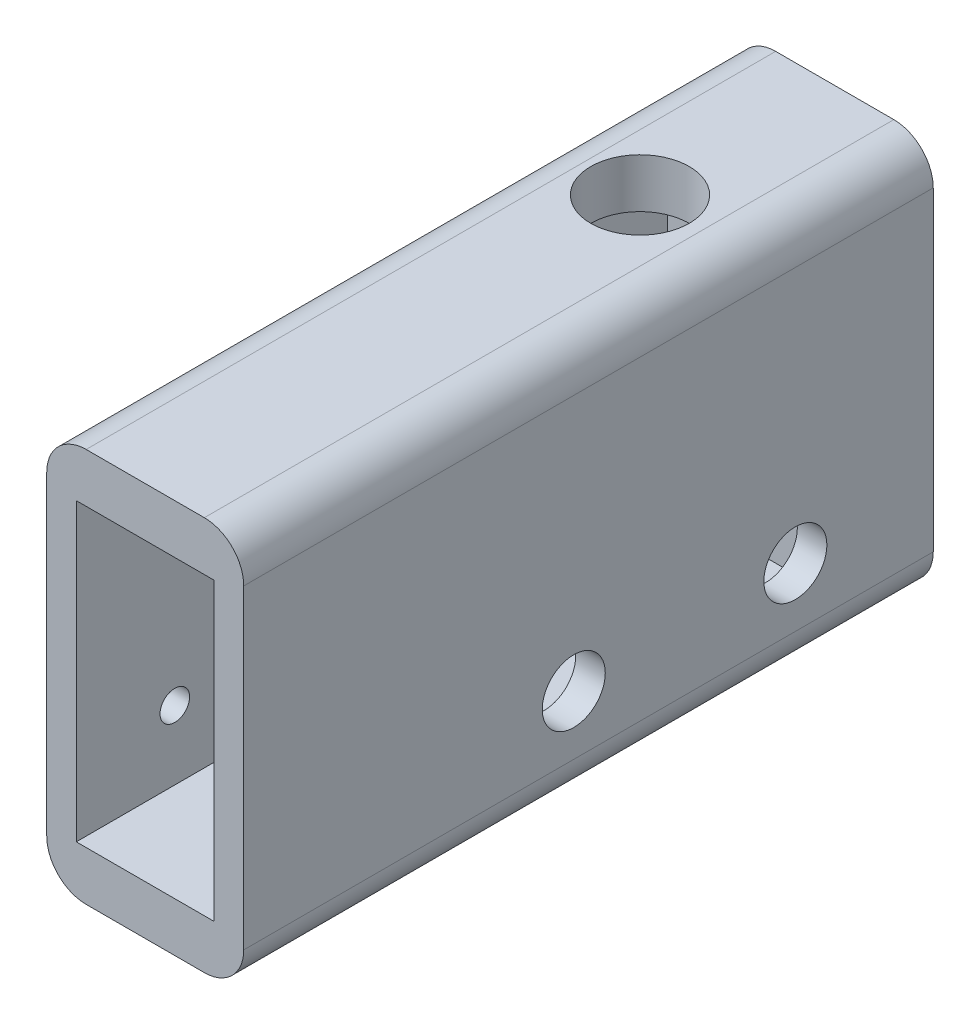
ISO-10303-21;
HEADER;
FILE_DESCRIPTION(('STEP AP214'),'2;1');
FILE_NAME('part.step','',(''),(''),'','','');
FILE_SCHEMA(('AUTOMOTIVE_DESIGN { 1 0 10303 214 1 1 1 1 }'));
ENDSEC;
DATA;
#1=APPLICATION_CONTEXT('core data for automotive mechanical design processes');
#2=APPLICATION_PROTOCOL_DEFINITION('international standard','automotive_design',2000,#1);
#3=PRODUCT_CONTEXT('',#1,'mechanical');
#4=PRODUCT('Part','Part','',(#3));
#5=PRODUCT_RELATED_PRODUCT_CATEGORY('part','',(#4));
#6=PRODUCT_DEFINITION_FORMATION('','',#4);
#7=PRODUCT_DEFINITION_CONTEXT('part definition',#1,'design');
#8=PRODUCT_DEFINITION('design','',#6,#7);
#9=PRODUCT_DEFINITION_SHAPE('','',#8);
#10=(LENGTH_UNIT() NAMED_UNIT(*) SI_UNIT(.MILLI.,.METRE.));
#11=(NAMED_UNIT(*) PLANE_ANGLE_UNIT() SI_UNIT($,.RADIAN.));
#12=(NAMED_UNIT(*) SI_UNIT($,.STERADIAN.) SOLID_ANGLE_UNIT());
#13=UNCERTAINTY_MEASURE_WITH_UNIT(LENGTH_MEASURE(1.E-05),#10,'distance_accuracy_value','');
#14=(GEOMETRIC_REPRESENTATION_CONTEXT(3) GLOBAL_UNCERTAINTY_ASSIGNED_CONTEXT((#13)) GLOBAL_UNIT_ASSIGNED_CONTEXT((#10,
#11,#12)) REPRESENTATION_CONTEXT('',''));
#15=CARTESIAN_POINT('',(0.,0.,0.));
#16=DIRECTION('',(0.,0.,1.));
#17=DIRECTION('',(1.,0.,0.));
#18=AXIS2_PLACEMENT_3D('',#15,#16,#17);
#19=CARTESIAN_POINT('',(0.,0.,35.));
#20=DIRECTION('',(1.,0.,0.));
#21=DIRECTION('',(0.,0.,-1.));
#22=AXIS2_PLACEMENT_3D('',#19,#20,#21);
#23=PLANE('',#22);
#24=CARTESIAN_POINT('',(0.,5.,18.2481238100749));
#25=DIRECTION('',(1.,0.,0.));
#26=DIRECTION('',(0.,0.,-1.));
#27=AXIS2_PLACEMENT_3D('',#24,#25,#26);
#28=CIRCLE('',#27,1.6);
#29=CARTESIAN_POINT('',(0.,5.,16.6481238100749));
#30=VERTEX_POINT('',#29);
#31=EDGE_CURVE('E404',#30,#30,#28,.T.);
#32=ORIENTED_EDGE('',*,*,#31,.T.);
#33=EDGE_LOOP('',(#32));
#34=FACE_BOUND('',#33,.T.);
#35=CARTESIAN_POINT('',(0.,5.,7.));
#36=DIRECTION('',(1.,0.,0.));
#37=DIRECTION('',(0.,0.,-1.));
#38=AXIS2_PLACEMENT_3D('',#35,#36,#37);
#39=CIRCLE('',#38,1.6);
#40=CARTESIAN_POINT('',(0.,5.,5.4));
#41=VERTEX_POINT('',#40);
#42=EDGE_CURVE('E238',#41,#41,#39,.T.);
#43=ORIENTED_EDGE('',*,*,#42,.T.);
#44=EDGE_LOOP('',(#43));
#45=FACE_BOUND('',#44,.T.);
#46=CARTESIAN_POINT('',(0.,6.,30.));
#47=DIRECTION('',(-1.,0.,0.));
#48=DIRECTION('',(0.,0.,1.));
#49=AXIS2_PLACEMENT_3D('',#46,#47,#48);
#50=CIRCLE('',#49,0.750000000000002);
#51=CARTESIAN_POINT('',(0.,6.,30.75));
#52=VERTEX_POINT('',#51);
#53=EDGE_CURVE('E205',#52,#52,#50,.T.);
#54=ORIENTED_EDGE('',*,*,#53,.F.);
#55=EDGE_LOOP('',(#54));
#56=FACE_BOUND('',#55,.T.);
#57=CARTESIAN_POINT('',(0.,14.,30.));
#58=DIRECTION('',(-1.,0.,0.));
#59=DIRECTION('',(0.,0.,1.));
#60=AXIS2_PLACEMENT_3D('',#57,#58,#59);
#61=CIRCLE('',#60,0.750000000000002);
#62=CARTESIAN_POINT('',(0.,14.,30.75));
#63=VERTEX_POINT('',#62);
#64=EDGE_CURVE('E201',#63,#63,#61,.T.);
#65=ORIENTED_EDGE('',*,*,#64,.F.);
#66=EDGE_LOOP('',(#65));
#67=FACE_BOUND('',#66,.T.);
#68=DIRECTION('',(0.,-1.,0.));
#69=VECTOR('',#68,1.);
#70=CARTESIAN_POINT('',(0.,0.,0.));
#71=LINE('',#70,#69);
#72=CARTESIAN_POINT('',(0.,18.,0.));
#73=VERTEX_POINT('',#72);
#74=CARTESIAN_POINT('',(0.,2.,0.));
#75=VERTEX_POINT('',#74);
#76=EDGE_CURVE('E168',#73,#75,#71,.T.);
#77=ORIENTED_EDGE('',*,*,#76,.T.);
#78=DIRECTION('',(0.,0.,-1.));
#79=VECTOR('',#78,1.);
#80=CARTESIAN_POINT('',(0.,2.,35.));
#81=LINE('',#80,#79);
#82=CARTESIAN_POINT('',(0.,2.,35.));
#83=VERTEX_POINT('',#82);
#84=EDGE_CURVE('E11',#75,#83,#81,.F.);
#85=ORIENTED_EDGE('',*,*,#84,.T.);
#86=DIRECTION('',(0.,-1.,0.));
#87=VECTOR('',#86,1.);
#88=CARTESIAN_POINT('',(0.,0.,35.));
#89=LINE('',#88,#87);
#90=CARTESIAN_POINT('',(0.,18.,35.));
#91=VERTEX_POINT('',#90);
#92=EDGE_CURVE('E172',#91,#83,#89,.T.);
#93=ORIENTED_EDGE('',*,*,#92,.F.);
#94=DIRECTION('',(0.,0.,-1.));
#95=VECTOR('',#94,1.);
#96=CARTESIAN_POINT('',(0.,18.,35.));
#97=LINE('',#96,#95);
#98=EDGE_CURVE('E42',#91,#73,#97,.T.);
#99=ORIENTED_EDGE('',*,*,#98,.T.);
#100=EDGE_LOOP('',(#77,#85,#93,#99));
#101=FACE_BOUND('',#100,.T.);
#102=ADVANCED_FACE('F33',(#34,#45,#56,#67,#101),#23,.F.);
#103=CARTESIAN_POINT('',(0.,0.,35.));
#104=DIRECTION('',(0.,1.,0.));
#105=DIRECTION('',(0.,0.,1.));
#106=AXIS2_PLACEMENT_3D('',#103,#104,#105);
#107=PLANE('',#106);
#108=DIRECTION('',(1.,0.,0.));
#109=VECTOR('',#108,1.);
#110=CARTESIAN_POINT('',(0.,0.,0.));
#111=LINE('',#110,#109);
#112=CARTESIAN_POINT('',(2.,0.,0.));
#113=VERTEX_POINT('',#112);
#114=CARTESIAN_POINT('',(8.,0.,0.));
#115=VERTEX_POINT('',#114);
#116=EDGE_CURVE('E186',#113,#115,#111,.T.);
#117=ORIENTED_EDGE('',*,*,#116,.T.);
#118=DIRECTION('',(0.,0.,-1.));
#119=VECTOR('',#118,1.);
#120=CARTESIAN_POINT('',(8.,0.,35.));
#121=LINE('',#120,#119);
#122=CARTESIAN_POINT('',(8.,0.,35.));
#123=VERTEX_POINT('',#122);
#124=EDGE_CURVE('E50',#115,#123,#121,.F.);
#125=ORIENTED_EDGE('',*,*,#124,.T.);
#126=DIRECTION('',(1.,0.,0.));
#127=VECTOR('',#126,1.);
#128=CARTESIAN_POINT('',(0.,0.,35.));
#129=LINE('',#128,#127);
#130=CARTESIAN_POINT('',(2.,0.,35.));
#131=VERTEX_POINT('',#130);
#132=EDGE_CURVE('E174',#131,#123,#129,.T.);
#133=ORIENTED_EDGE('',*,*,#132,.F.);
#134=DIRECTION('',(0.,0.,-1.));
#135=VECTOR('',#134,1.);
#136=CARTESIAN_POINT('',(2.,0.,35.));
#137=LINE('',#136,#135);
#138=EDGE_CURVE('E230',#131,#113,#137,.T.);
#139=ORIENTED_EDGE('',*,*,#138,.T.);
#140=EDGE_LOOP('',(#117,#125,#133,#139));
#141=FACE_BOUND('',#140,.T.);
#142=ADVANCED_FACE('F287',(#141),#107,.F.);
#143=CARTESIAN_POINT('',(10.,0.,35.));
#144=DIRECTION('',(-1.,0.,0.));
#145=DIRECTION('',(0.,0.,1.));
#146=AXIS2_PLACEMENT_3D('',#143,#144,#145);
#147=PLANE('',#146);
#148=CARTESIAN_POINT('',(10.,5.,18.2481238100749));
#149=DIRECTION('',(1.,0.,0.));
#150=DIRECTION('',(0.,0.,-1.));
#151=AXIS2_PLACEMENT_3D('',#148,#149,#150);
#152=CIRCLE('',#151,1.6);
#153=CARTESIAN_POINT('',(10.,5.,16.6481238100749));
#154=VERTEX_POINT('',#153);
#155=EDGE_CURVE('E409',#154,#154,#152,.T.);
#156=ORIENTED_EDGE('',*,*,#155,.F.);
#157=EDGE_LOOP('',(#156));
#158=FACE_BOUND('',#157,.T.);
#159=CARTESIAN_POINT('',(10.,5.,7.));
#160=DIRECTION('',(1.,0.,0.));
#161=DIRECTION('',(0.,0.,-1.));
#162=AXIS2_PLACEMENT_3D('',#159,#160,#161);
#163=CIRCLE('',#162,1.6);
#164=CARTESIAN_POINT('',(10.,5.,5.4));
#165=VERTEX_POINT('',#164);
#166=EDGE_CURVE('E244',#165,#165,#163,.T.);
#167=ORIENTED_EDGE('',*,*,#166,.F.);
#168=EDGE_LOOP('',(#167));
#169=FACE_BOUND('',#168,.T.);
#170=DIRECTION('',(0.,1.,0.));
#171=VECTOR('',#170,1.);
#172=CARTESIAN_POINT('',(10.,0.,0.));
#173=LINE('',#172,#171);
#174=CARTESIAN_POINT('',(10.,2.,0.));
#175=VERTEX_POINT('',#174);
#176=CARTESIAN_POINT('',(10.,18.,0.));
#177=VERTEX_POINT('',#176);
#178=EDGE_CURVE('E188',#175,#177,#173,.T.);
#179=ORIENTED_EDGE('',*,*,#178,.T.);
#180=DIRECTION('',(0.,0.,-1.));
#181=VECTOR('',#180,1.);
#182=CARTESIAN_POINT('',(10.,18.,35.));
#183=LINE('',#182,#181);
#184=CARTESIAN_POINT('',(10.,18.,35.));
#185=VERTEX_POINT('',#184);
#186=EDGE_CURVE('E221',#177,#185,#183,.F.);
#187=ORIENTED_EDGE('',*,*,#186,.T.);
#188=DIRECTION('',(0.,1.,0.));
#189=VECTOR('',#188,1.);
#190=CARTESIAN_POINT('',(10.,0.,35.));
#191=LINE('',#190,#189);
#192=CARTESIAN_POINT('',(10.,2.,35.));
#193=VERTEX_POINT('',#192);
#194=EDGE_CURVE('E177',#193,#185,#191,.T.);
#195=ORIENTED_EDGE('',*,*,#194,.F.);
#196=DIRECTION('',(0.,0.,-1.));
#197=VECTOR('',#196,1.);
#198=CARTESIAN_POINT('',(10.,2.,35.));
#199=LINE('',#198,#197);
#200=EDGE_CURVE('E218',#193,#175,#199,.T.);
#201=ORIENTED_EDGE('',*,*,#200,.T.);
#202=EDGE_LOOP('',(#179,#187,#195,#201));
#203=FACE_BOUND('',#202,.T.);
#204=ADVANCED_FACE('F295',(#158,#169,#203),#147,.F.);
#205=CARTESIAN_POINT('',(0.,20.,35.));
#206=DIRECTION('',(0.,-1.,0.));
#207=DIRECTION('',(0.,0.,-1.));
#208=AXIS2_PLACEMENT_3D('',#205,#206,#207);
#209=PLANE('',#208);
#210=CARTESIAN_POINT('',(4.86841114956782,20.,9.75455177553286));
#211=DIRECTION('',(0.,1.,0.));
#212=DIRECTION('',(0.,0.,1.));
#213=AXIS2_PLACEMENT_3D('',#210,#211,#212);
#214=CIRCLE('',#213,2.5);
#215=CARTESIAN_POINT('',(4.86841114956782,20.,12.2545517755329));
#216=VERTEX_POINT('',#215);
#217=EDGE_CURVE('E197',#216,#216,#214,.T.);
#218=ORIENTED_EDGE('',*,*,#217,.F.);
#219=EDGE_LOOP('',(#218));
#220=FACE_BOUND('',#219,.T.);
#221=DIRECTION('',(-1.,0.,0.));
#222=VECTOR('',#221,1.);
#223=CARTESIAN_POINT('',(0.,20.,35.));
#224=LINE('',#223,#222);
#225=CARTESIAN_POINT('',(8.,20.,35.));
#226=VERTEX_POINT('',#225);
#227=CARTESIAN_POINT('',(2.,20.,35.));
#228=VERTEX_POINT('',#227);
#229=EDGE_CURVE('E180',#226,#228,#224,.T.);
#230=ORIENTED_EDGE('',*,*,#229,.F.);
#231=DIRECTION('',(0.,0.,-1.));
#232=VECTOR('',#231,1.);
#233=CARTESIAN_POINT('',(8.,20.,35.));
#234=LINE('',#233,#232);
#235=CARTESIAN_POINT('',(8.,20.,0.));
#236=VERTEX_POINT('',#235);
#237=EDGE_CURVE('E207',#226,#236,#234,.T.);
#238=ORIENTED_EDGE('',*,*,#237,.T.);
#239=DIRECTION('',(-1.,0.,0.));
#240=VECTOR('',#239,1.);
#241=CARTESIAN_POINT('',(0.,20.,0.));
#242=LINE('',#241,#240);
#243=CARTESIAN_POINT('',(2.,20.,0.));
#244=VERTEX_POINT('',#243);
#245=EDGE_CURVE('E175',#236,#244,#242,.T.);
#246=ORIENTED_EDGE('',*,*,#245,.T.);
#247=DIRECTION('',(0.,0.,-1.));
#248=VECTOR('',#247,1.);
#249=CARTESIAN_POINT('',(2.,20.,35.));
#250=LINE('',#249,#248);
#251=EDGE_CURVE('E183',#244,#228,#250,.F.);
#252=ORIENTED_EDGE('',*,*,#251,.T.);
#253=EDGE_LOOP('',(#230,#238,#246,#252));
#254=FACE_BOUND('',#253,.T.);
#255=ADVANCED_FACE('F334',(#220,#254),#209,.F.);
#256=CARTESIAN_POINT('',(0.,0.,35.));
#257=DIRECTION('',(0.,0.,-1.));
#258=DIRECTION('',(-1.,0.,0.));
#259=AXIS2_PLACEMENT_3D('',#256,#257,#258);
#260=PLANE('',#259);
#261=DIRECTION('',(1.,0.,0.));
#262=VECTOR('',#261,1.);
#263=CARTESIAN_POINT('',(1.5,2.5,35.));
#264=LINE('',#263,#262);
#265=CARTESIAN_POINT('',(1.5,2.5,35.));
#266=VERTEX_POINT('',#265);
#267=CARTESIAN_POINT('',(8.5,2.5,35.));
#268=VERTEX_POINT('',#267);
#269=EDGE_CURVE('E161',#266,#268,#264,.T.);
#270=ORIENTED_EDGE('',*,*,#269,.F.);
#271=DIRECTION('',(0.,-1.,0.));
#272=VECTOR('',#271,1.);
#273=CARTESIAN_POINT('',(1.5,2.5,35.));
#274=LINE('',#273,#272);
#275=CARTESIAN_POINT('',(1.5,17.5,35.));
#276=VERTEX_POINT('',#275);
#277=EDGE_CURVE('E132',#276,#266,#274,.T.);
#278=ORIENTED_EDGE('',*,*,#277,.F.);
#279=DIRECTION('',(-1.,0.,0.));
#280=VECTOR('',#279,1.);
#281=CARTESIAN_POINT('',(1.5,17.5,35.));
#282=LINE('',#281,#280);
#283=CARTESIAN_POINT('',(8.5,17.5,35.));
#284=VERTEX_POINT('',#283);
#285=EDGE_CURVE('E149',#284,#276,#282,.T.);
#286=ORIENTED_EDGE('',*,*,#285,.F.);
#287=DIRECTION('',(0.,1.,0.));
#288=VECTOR('',#287,1.);
#289=CARTESIAN_POINT('',(8.5,2.5,35.));
#290=LINE('',#289,#288);
#291=EDGE_CURVE('E152',#268,#284,#290,.T.);
#292=ORIENTED_EDGE('',*,*,#291,.F.);
#293=EDGE_LOOP('',(#270,#278,#286,#292));
#294=FACE_BOUND('',#293,.T.);
#295=ORIENTED_EDGE('',*,*,#194,.T.);
#296=CARTESIAN_POINT('',(8.,18.,35.));
#297=DIRECTION('',(0.,0.,-1.));
#298=DIRECTION('',(-1.,0.,0.));
#299=AXIS2_PLACEMENT_3D('',#296,#297,#298);
#300=CIRCLE('',#299,2.);
#301=EDGE_CURVE('E228',#185,#226,#300,.F.);
#302=ORIENTED_EDGE('',*,*,#301,.T.);
#303=ORIENTED_EDGE('',*,*,#229,.T.);
#304=CARTESIAN_POINT('',(2.,18.,35.));
#305=DIRECTION('',(0.,0.,-1.));
#306=DIRECTION('',(-1.,0.,0.));
#307=AXIS2_PLACEMENT_3D('',#304,#305,#306);
#308=CIRCLE('',#307,2.);
#309=EDGE_CURVE('E223',#228,#91,#308,.F.);
#310=ORIENTED_EDGE('',*,*,#309,.T.);
#311=ORIENTED_EDGE('',*,*,#92,.T.);
#312=CARTESIAN_POINT('',(2.,2.,35.));
#313=DIRECTION('',(0.,0.,-1.));
#314=DIRECTION('',(-1.,0.,0.));
#315=AXIS2_PLACEMENT_3D('',#312,#313,#314);
#316=CIRCLE('',#315,2.);
#317=EDGE_CURVE('E57',#83,#131,#316,.F.);
#318=ORIENTED_EDGE('',*,*,#317,.T.);
#319=ORIENTED_EDGE('',*,*,#132,.T.);
#320=CARTESIAN_POINT('',(8.,2.,35.));
#321=DIRECTION('',(0.,0.,-1.));
#322=DIRECTION('',(-1.,0.,0.));
#323=AXIS2_PLACEMENT_3D('',#320,#321,#322);
#324=CIRCLE('',#323,2.);
#325=EDGE_CURVE('E226',#123,#193,#324,.F.);
#326=ORIENTED_EDGE('',*,*,#325,.T.);
#327=EDGE_LOOP('',(#295,#302,#303,#310,#311,#318,#319,#326));
#328=FACE_BOUND('',#327,.T.);
#329=ADVANCED_FACE('F330',(#294,#328),#260,.F.);
#330=CARTESIAN_POINT('',(0.,0.,0.));
#331=DIRECTION('',(0.,0.,-1.));
#332=DIRECTION('',(-1.,0.,0.));
#333=AXIS2_PLACEMENT_3D('',#330,#331,#332);
#334=PLANE('',#333);
#335=CARTESIAN_POINT('',(5.,6.28024824363482,0.));
#336=DIRECTION('',(0.,0.,1.));
#337=DIRECTION('',(1.,0.,0.));
#338=AXIS2_PLACEMENT_3D('',#335,#336,#337);
#339=CIRCLE('',#338,1.55);
#340=CARTESIAN_POINT('',(6.55,6.28024824363482,0.));
#341=VERTEX_POINT('',#340);
#342=EDGE_CURVE('E260',#341,#341,#339,.T.);
#343=ORIENTED_EDGE('',*,*,#342,.T.);
#344=EDGE_LOOP('',(#343));
#345=FACE_BOUND('',#344,.T.);
#346=CARTESIAN_POINT('',(5.,14.527380154147,0.));
#347=DIRECTION('',(0.,0.,1.));
#348=DIRECTION('',(1.,0.,0.));
#349=AXIS2_PLACEMENT_3D('',#346,#347,#348);
#350=CIRCLE('',#349,1.55);
#351=CARTESIAN_POINT('',(6.55,14.527380154147,0.));
#352=VERTEX_POINT('',#351);
#353=EDGE_CURVE('E162',#352,#352,#350,.T.);
#354=ORIENTED_EDGE('',*,*,#353,.T.);
#355=EDGE_LOOP('',(#354));
#356=FACE_BOUND('',#355,.T.);
#357=ORIENTED_EDGE('',*,*,#245,.F.);
#358=CARTESIAN_POINT('',(8.,18.,0.));
#359=DIRECTION('',(0.,0.,-1.));
#360=DIRECTION('',(-1.,0.,0.));
#361=AXIS2_PLACEMENT_3D('',#358,#359,#360);
#362=CIRCLE('',#361,2.);
#363=EDGE_CURVE('E216',#236,#177,#362,.T.);
#364=ORIENTED_EDGE('',*,*,#363,.T.);
#365=ORIENTED_EDGE('',*,*,#178,.F.);
#366=CARTESIAN_POINT('',(8.,2.,0.));
#367=DIRECTION('',(0.,0.,-1.));
#368=DIRECTION('',(-1.,0.,0.));
#369=AXIS2_PLACEMENT_3D('',#366,#367,#368);
#370=CIRCLE('',#369,2.);
#371=EDGE_CURVE('E214',#175,#115,#370,.T.);
#372=ORIENTED_EDGE('',*,*,#371,.T.);
#373=ORIENTED_EDGE('',*,*,#116,.F.);
#374=CARTESIAN_POINT('',(2.,2.,0.));
#375=DIRECTION('',(0.,0.,-1.));
#376=DIRECTION('',(-1.,0.,0.));
#377=AXIS2_PLACEMENT_3D('',#374,#375,#376);
#378=CIRCLE('',#377,2.);
#379=EDGE_CURVE('E212',#113,#75,#378,.T.);
#380=ORIENTED_EDGE('',*,*,#379,.T.);
#381=ORIENTED_EDGE('',*,*,#76,.F.);
#382=CARTESIAN_POINT('',(2.,18.,0.));
#383=DIRECTION('',(0.,0.,-1.));
#384=DIRECTION('',(-1.,0.,0.));
#385=AXIS2_PLACEMENT_3D('',#382,#383,#384);
#386=CIRCLE('',#385,2.);
#387=EDGE_CURVE('E210',#73,#244,#386,.T.);
#388=ORIENTED_EDGE('',*,*,#387,.T.);
#389=EDGE_LOOP('',(#357,#364,#365,#372,#373,#380,#381,#388));
#390=FACE_BOUND('',#389,.T.);
#391=ADVANCED_FACE('F321',(#345,#356,#390),#334,.T.);
#392=CARTESIAN_POINT('',(1.5,2.5,5.));
#393=DIRECTION('',(-1.,0.,0.));
#394=DIRECTION('',(0.,0.,1.));
#395=AXIS2_PLACEMENT_3D('',#392,#393,#394);
#396=PLANE('',#395);
#397=CARTESIAN_POINT('',(1.5,5.,18.2481238100749));
#398=DIRECTION('',(-1.,0.,0.));
#399=DIRECTION('',(0.,0.,1.));
#400=AXIS2_PLACEMENT_3D('',#397,#398,#399);
#401=CIRCLE('',#400,1.6);
#402=CARTESIAN_POINT('',(1.5,5.,19.8481238100749));
#403=VERTEX_POINT('',#402);
#404=EDGE_CURVE('E249',#403,#403,#401,.T.);
#405=ORIENTED_EDGE('',*,*,#404,.T.);
#406=EDGE_LOOP('',(#405));
#407=FACE_BOUND('',#406,.T.);
#408=CARTESIAN_POINT('',(1.5,5.,7.));
#409=DIRECTION('',(-1.,0.,0.));
#410=DIRECTION('',(0.,0.,1.));
#411=AXIS2_PLACEMENT_3D('',#408,#409,#410);
#412=CIRCLE('',#411,1.6);
#413=CARTESIAN_POINT('',(1.5,5.,8.6));
#414=VERTEX_POINT('',#413);
#415=EDGE_CURVE('E237',#414,#414,#412,.T.);
#416=ORIENTED_EDGE('',*,*,#415,.T.);
#417=EDGE_LOOP('',(#416));
#418=FACE_BOUND('',#417,.T.);
#419=CARTESIAN_POINT('',(1.5,6.,30.));
#420=DIRECTION('',(-1.,0.,0.));
#421=DIRECTION('',(0.,0.,1.));
#422=AXIS2_PLACEMENT_3D('',#419,#420,#421);
#423=CIRCLE('',#422,0.750000000000002);
#424=CARTESIAN_POINT('',(1.5,6.,30.75));
#425=VERTEX_POINT('',#424);
#426=EDGE_CURVE('E202',#425,#425,#423,.T.);
#427=ORIENTED_EDGE('',*,*,#426,.T.);
#428=EDGE_LOOP('',(#427));
#429=FACE_BOUND('',#428,.T.);
#430=CARTESIAN_POINT('',(1.5,14.,30.));
#431=DIRECTION('',(-1.,0.,0.));
#432=DIRECTION('',(0.,0.,1.));
#433=AXIS2_PLACEMENT_3D('',#430,#431,#432);
#434=CIRCLE('',#433,0.750000000000002);
#435=CARTESIAN_POINT('',(1.5,14.,30.75));
#436=VERTEX_POINT('',#435);
#437=EDGE_CURVE('E198',#436,#436,#434,.T.);
#438=ORIENTED_EDGE('',*,*,#437,.T.);
#439=EDGE_LOOP('',(#438));
#440=FACE_BOUND('',#439,.T.);
#441=ORIENTED_EDGE('',*,*,#277,.T.);
#442=DIRECTION('',(0.,0.,1.));
#443=VECTOR('',#442,1.);
#444=CARTESIAN_POINT('',(1.5,2.5,5.));
#445=LINE('',#444,#443);
#446=CARTESIAN_POINT('',(1.5,2.5,5.));
#447=VERTEX_POINT('',#446);
#448=EDGE_CURVE('E125',#447,#266,#445,.T.);
#449=ORIENTED_EDGE('',*,*,#448,.F.);
#450=DIRECTION('',(0.,-1.,0.));
#451=VECTOR('',#450,1.);
#452=CARTESIAN_POINT('',(1.5,2.5,5.));
#453=LINE('',#452,#451);
#454=CARTESIAN_POINT('',(1.5,17.5,5.));
#455=VERTEX_POINT('',#454);
#456=EDGE_CURVE('E129',#455,#447,#453,.T.);
#457=ORIENTED_EDGE('',*,*,#456,.F.);
#458=DIRECTION('',(0.,0.,1.));
#459=VECTOR('',#458,1.);
#460=CARTESIAN_POINT('',(1.5,17.5,5.));
#461=LINE('',#460,#459);
#462=EDGE_CURVE('E166',#455,#276,#461,.T.);
#463=ORIENTED_EDGE('',*,*,#462,.T.);
#464=EDGE_LOOP('',(#441,#449,#457,#463));
#465=FACE_BOUND('',#464,.T.);
#466=ADVANCED_FACE('F127',(#407,#418,#429,#440,#465),#396,.F.);
#467=CARTESIAN_POINT('',(1.5,17.5,5.));
#468=DIRECTION('',(0.,1.,0.));
#469=DIRECTION('',(0.,0.,1.));
#470=AXIS2_PLACEMENT_3D('',#467,#468,#469);
#471=PLANE('',#470);
#472=CARTESIAN_POINT('',(4.86841114956782,17.5,9.75455177553286));
#473=DIRECTION('',(0.,1.,0.));
#474=DIRECTION('',(0.,0.,1.));
#475=AXIS2_PLACEMENT_3D('',#472,#473,#474);
#476=CIRCLE('',#475,2.5);
#477=CARTESIAN_POINT('',(4.86841114956782,17.5,12.2545517755329));
#478=VERTEX_POINT('',#477);
#479=EDGE_CURVE('E193',#478,#478,#476,.T.);
#480=ORIENTED_EDGE('',*,*,#479,.T.);
#481=EDGE_LOOP('',(#480));
#482=FACE_BOUND('',#481,.T.);
#483=ORIENTED_EDGE('',*,*,#285,.T.);
#484=ORIENTED_EDGE('',*,*,#462,.F.);
#485=DIRECTION('',(-1.,0.,0.));
#486=VECTOR('',#485,1.);
#487=CARTESIAN_POINT('',(1.5,17.5,5.));
#488=LINE('',#487,#486);
#489=CARTESIAN_POINT('',(8.5,17.5,5.));
#490=VERTEX_POINT('',#489);
#491=EDGE_CURVE('E137',#490,#455,#488,.T.);
#492=ORIENTED_EDGE('',*,*,#491,.F.);
#493=DIRECTION('',(0.,0.,1.));
#494=VECTOR('',#493,1.);
#495=CARTESIAN_POINT('',(8.5,17.5,5.));
#496=LINE('',#495,#494);
#497=EDGE_CURVE('E169',#490,#284,#496,.T.);
#498=ORIENTED_EDGE('',*,*,#497,.T.);
#499=EDGE_LOOP('',(#483,#484,#492,#498));
#500=FACE_BOUND('',#499,.T.);
#501=ADVANCED_FACE('F356',(#482,#500),#471,.F.);
#502=CARTESIAN_POINT('',(8.5,2.5,5.));
#503=DIRECTION('',(1.,0.,0.));
#504=DIRECTION('',(0.,0.,-1.));
#505=AXIS2_PLACEMENT_3D('',#502,#503,#504);
#506=PLANE('',#505);
#507=CARTESIAN_POINT('',(8.5,5.,18.2481238100749));
#508=DIRECTION('',(1.,0.,0.));
#509=DIRECTION('',(0.,0.,-1.));
#510=AXIS2_PLACEMENT_3D('',#507,#508,#509);
#511=CIRCLE('',#510,1.6);
#512=CARTESIAN_POINT('',(8.5,5.,16.6481238100749));
#513=VERTEX_POINT('',#512);
#514=EDGE_CURVE('E37',#513,#513,#511,.T.);
#515=ORIENTED_EDGE('',*,*,#514,.T.);
#516=EDGE_LOOP('',(#515));
#517=FACE_BOUND('',#516,.T.);
#518=CARTESIAN_POINT('',(8.5,5.,7.));
#519=DIRECTION('',(1.,0.,0.));
#520=DIRECTION('',(0.,0.,-1.));
#521=AXIS2_PLACEMENT_3D('',#518,#519,#520);
#522=CIRCLE('',#521,1.6);
#523=CARTESIAN_POINT('',(8.5,5.,5.4));
#524=VERTEX_POINT('',#523);
#525=EDGE_CURVE('E235',#524,#524,#522,.T.);
#526=ORIENTED_EDGE('',*,*,#525,.T.);
#527=EDGE_LOOP('',(#526));
#528=FACE_BOUND('',#527,.T.);
#529=ORIENTED_EDGE('',*,*,#291,.T.);
#530=ORIENTED_EDGE('',*,*,#497,.F.);
#531=DIRECTION('',(0.,1.,0.));
#532=VECTOR('',#531,1.);
#533=CARTESIAN_POINT('',(8.5,2.5,5.));
#534=LINE('',#533,#532);
#535=CARTESIAN_POINT('',(8.5,2.5,5.));
#536=VERTEX_POINT('',#535);
#537=EDGE_CURVE('E145',#536,#490,#534,.T.);
#538=ORIENTED_EDGE('',*,*,#537,.F.);
#539=DIRECTION('',(0.,0.,1.));
#540=VECTOR('',#539,1.);
#541=CARTESIAN_POINT('',(8.5,2.5,5.));
#542=LINE('',#541,#540);
#543=EDGE_CURVE('E136',#536,#268,#542,.T.);
#544=ORIENTED_EDGE('',*,*,#543,.T.);
#545=EDGE_LOOP('',(#529,#530,#538,#544));
#546=FACE_BOUND('',#545,.T.);
#547=ADVANCED_FACE('F282',(#517,#528,#546),#506,.F.);
#548=CARTESIAN_POINT('',(1.5,2.5,5.));
#549=DIRECTION('',(0.,-1.,0.));
#550=DIRECTION('',(0.,0.,-1.));
#551=AXIS2_PLACEMENT_3D('',#548,#549,#550);
#552=PLANE('',#551);
#553=ORIENTED_EDGE('',*,*,#269,.T.);
#554=ORIENTED_EDGE('',*,*,#543,.F.);
#555=DIRECTION('',(1.,0.,0.));
#556=VECTOR('',#555,1.);
#557=CARTESIAN_POINT('',(1.5,2.5,5.));
#558=LINE('',#557,#556);
#559=EDGE_CURVE('E140',#447,#536,#558,.T.);
#560=ORIENTED_EDGE('',*,*,#559,.F.);
#561=ORIENTED_EDGE('',*,*,#448,.T.);
#562=EDGE_LOOP('',(#553,#554,#560,#561));
#563=FACE_BOUND('',#562,.T.);
#564=ADVANCED_FACE('F141',(#563),#552,.F.);
#565=CARTESIAN_POINT('',(0.,0.,5.));
#566=DIRECTION('',(0.,0.,-1.));
#567=DIRECTION('',(-1.,0.,0.));
#568=AXIS2_PLACEMENT_3D('',#565,#566,#567);
#569=PLANE('',#568);
#570=CARTESIAN_POINT('',(5.,6.28024824363482,5.));
#571=DIRECTION('',(0.,0.,1.));
#572=DIRECTION('',(1.,0.,0.));
#573=AXIS2_PLACEMENT_3D('',#570,#571,#572);
#574=CIRCLE('',#573,1.55);
#575=CARTESIAN_POINT('',(6.55,6.28024824363482,5.));
#576=VERTEX_POINT('',#575);
#577=EDGE_CURVE('E196',#576,#576,#574,.T.);
#578=ORIENTED_EDGE('',*,*,#577,.F.);
#579=EDGE_LOOP('',(#578));
#580=FACE_BOUND('',#579,.T.);
#581=CARTESIAN_POINT('',(5.,14.527380154147,5.));
#582=DIRECTION('',(0.,0.,1.));
#583=DIRECTION('',(1.,0.,0.));
#584=AXIS2_PLACEMENT_3D('',#581,#582,#583);
#585=CIRCLE('',#584,1.55);
#586=CARTESIAN_POINT('',(6.55,14.527380154147,5.));
#587=VERTEX_POINT('',#586);
#588=EDGE_CURVE('E155',#587,#587,#585,.T.);
#589=ORIENTED_EDGE('',*,*,#588,.F.);
#590=EDGE_LOOP('',(#589));
#591=FACE_BOUND('',#590,.T.);
#592=ORIENTED_EDGE('',*,*,#456,.T.);
#593=ORIENTED_EDGE('',*,*,#559,.T.);
#594=ORIENTED_EDGE('',*,*,#537,.T.);
#595=ORIENTED_EDGE('',*,*,#491,.T.);
#596=EDGE_LOOP('',(#592,#593,#594,#595));
#597=FACE_BOUND('',#596,.T.);
#598=ADVANCED_FACE('F147',(#580,#591,#597),#569,.F.);
#599=CARTESIAN_POINT('',(5.,14.527380154147,0.));
#600=DIRECTION('',(0.,0.,1.));
#601=DIRECTION('',(1.,0.,0.));
#602=AXIS2_PLACEMENT_3D('',#599,#600,#601);
#603=CYLINDRICAL_SURFACE('',#602,1.55);
#604=ORIENTED_EDGE('',*,*,#353,.F.);
#605=EDGE_LOOP('',(#604));
#606=FACE_BOUND('',#605,.T.);
#607=ORIENTED_EDGE('',*,*,#588,.T.);
#608=EDGE_LOOP('',(#607));
#609=FACE_BOUND('',#608,.T.);
#610=ADVANCED_FACE('F270',(#606,#609),#603,.F.);
#611=CARTESIAN_POINT('',(5.,6.28024824363482,0.));
#612=DIRECTION('',(0.,0.,1.));
#613=DIRECTION('',(1.,0.,0.));
#614=AXIS2_PLACEMENT_3D('',#611,#612,#613);
#615=CYLINDRICAL_SURFACE('',#614,1.55);
#616=ORIENTED_EDGE('',*,*,#342,.F.);
#617=EDGE_LOOP('',(#616));
#618=FACE_BOUND('',#617,.T.);
#619=ORIENTED_EDGE('',*,*,#577,.T.);
#620=EDGE_LOOP('',(#619));
#621=FACE_BOUND('',#620,.T.);
#622=ADVANCED_FACE('F279',(#618,#621),#615,.F.);
#623=CARTESIAN_POINT('',(4.86841114956782,15.,9.75455177553286));
#624=DIRECTION('',(0.,1.,0.));
#625=DIRECTION('',(0.,0.,1.));
#626=AXIS2_PLACEMENT_3D('',#623,#624,#625);
#627=CYLINDRICAL_SURFACE('',#626,2.5);
#628=ORIENTED_EDGE('',*,*,#217,.T.);
#629=EDGE_LOOP('',(#628));
#630=FACE_BOUND('',#629,.T.);
#631=ORIENTED_EDGE('',*,*,#479,.F.);
#632=EDGE_LOOP('',(#631));
#633=FACE_BOUND('',#632,.T.);
#634=ADVANCED_FACE('F373',(#630,#633),#627,.F.);
#635=CARTESIAN_POINT('',(2.5,14.,30.));
#636=DIRECTION('',(-1.,0.,0.));
#637=DIRECTION('',(0.,0.,1.));
#638=AXIS2_PLACEMENT_3D('',#635,#636,#637);
#639=CYLINDRICAL_SURFACE('',#638,0.750000000000002);
#640=ORIENTED_EDGE('',*,*,#64,.T.);
#641=EDGE_LOOP('',(#640));
#642=FACE_BOUND('',#641,.T.);
#643=ORIENTED_EDGE('',*,*,#437,.F.);
#644=EDGE_LOOP('',(#643));
#645=FACE_BOUND('',#644,.T.);
#646=ADVANCED_FACE('F375',(#642,#645),#639,.F.);
#647=CARTESIAN_POINT('',(2.5,6.,30.));
#648=DIRECTION('',(-1.,0.,0.));
#649=DIRECTION('',(0.,0.,1.));
#650=AXIS2_PLACEMENT_3D('',#647,#648,#649);
#651=CYLINDRICAL_SURFACE('',#650,0.750000000000002);
#652=ORIENTED_EDGE('',*,*,#53,.T.);
#653=EDGE_LOOP('',(#652));
#654=FACE_BOUND('',#653,.T.);
#655=ORIENTED_EDGE('',*,*,#426,.F.);
#656=EDGE_LOOP('',(#655));
#657=FACE_BOUND('',#656,.T.);
#658=ADVANCED_FACE('F304',(#654,#657),#651,.F.);
#659=CARTESIAN_POINT('',(8.,18.,35.));
#660=DIRECTION('',(0.,0.,-1.));
#661=DIRECTION('',(-1.,0.,0.));
#662=AXIS2_PLACEMENT_3D('',#659,#660,#661);
#663=CYLINDRICAL_SURFACE('',#662,2.);
#664=ORIENTED_EDGE('',*,*,#301,.F.);
#665=ORIENTED_EDGE('',*,*,#186,.F.);
#666=ORIENTED_EDGE('',*,*,#363,.F.);
#667=ORIENTED_EDGE('',*,*,#237,.F.);
#668=EDGE_LOOP('',(#664,#665,#666,#667));
#669=FACE_BOUND('',#668,.T.);
#670=ADVANCED_FACE('F300',(#669),#663,.T.);
#671=CARTESIAN_POINT('',(8.,2.,35.));
#672=DIRECTION('',(0.,0.,-1.));
#673=DIRECTION('',(-1.,0.,0.));
#674=AXIS2_PLACEMENT_3D('',#671,#672,#673);
#675=CYLINDRICAL_SURFACE('',#674,2.);
#676=ORIENTED_EDGE('',*,*,#325,.F.);
#677=ORIENTED_EDGE('',*,*,#124,.F.);
#678=ORIENTED_EDGE('',*,*,#371,.F.);
#679=ORIENTED_EDGE('',*,*,#200,.F.);
#680=EDGE_LOOP('',(#676,#677,#678,#679));
#681=FACE_BOUND('',#680,.T.);
#682=ADVANCED_FACE('F303',(#681),#675,.T.);
#683=CARTESIAN_POINT('',(2.,2.,35.));
#684=DIRECTION('',(0.,0.,-1.));
#685=DIRECTION('',(-1.,0.,0.));
#686=AXIS2_PLACEMENT_3D('',#683,#684,#685);
#687=CYLINDRICAL_SURFACE('',#686,2.);
#688=ORIENTED_EDGE('',*,*,#317,.F.);
#689=ORIENTED_EDGE('',*,*,#84,.F.);
#690=ORIENTED_EDGE('',*,*,#379,.F.);
#691=ORIENTED_EDGE('',*,*,#138,.F.);
#692=EDGE_LOOP('',(#688,#689,#690,#691));
#693=FACE_BOUND('',#692,.T.);
#694=ADVANCED_FACE('F307',(#693),#687,.T.);
#695=CARTESIAN_POINT('',(2.,18.,35.));
#696=DIRECTION('',(0.,0.,-1.));
#697=DIRECTION('',(-1.,0.,0.));
#698=AXIS2_PLACEMENT_3D('',#695,#696,#697);
#699=CYLINDRICAL_SURFACE('',#698,2.);
#700=ORIENTED_EDGE('',*,*,#309,.F.);
#701=ORIENTED_EDGE('',*,*,#251,.F.);
#702=ORIENTED_EDGE('',*,*,#387,.F.);
#703=ORIENTED_EDGE('',*,*,#98,.F.);
#704=EDGE_LOOP('',(#700,#701,#702,#703));
#705=FACE_BOUND('',#704,.T.);
#706=ADVANCED_FACE('F35',(#705),#699,.T.);
#707=CARTESIAN_POINT('',(0.,5.,7.));
#708=DIRECTION('',(1.,0.,0.));
#709=DIRECTION('',(0.,0.,-1.));
#710=AXIS2_PLACEMENT_3D('',#707,#708,#709);
#711=CYLINDRICAL_SURFACE('',#710,1.6);
#712=ORIENTED_EDGE('',*,*,#166,.T.);
#713=EDGE_LOOP('',(#712));
#714=FACE_BOUND('',#713,.T.);
#715=ORIENTED_EDGE('',*,*,#525,.F.);
#716=EDGE_LOOP('',(#715));
#717=FACE_BOUND('',#716,.T.);
#718=ADVANCED_FACE('F314',(#714,#717),#711,.F.);
#719=ORIENTED_EDGE('',*,*,#42,.F.);
#720=EDGE_LOOP('',(#719));
#721=FACE_BOUND('',#720,.T.);
#722=ORIENTED_EDGE('',*,*,#415,.F.);
#723=EDGE_LOOP('',(#722));
#724=FACE_BOUND('',#723,.T.);
#725=ADVANCED_FACE('F390',(#721,#724),#711,.F.);
#726=CARTESIAN_POINT('',(0.,5.,18.2481238100749));
#727=DIRECTION('',(1.,0.,0.));
#728=DIRECTION('',(0.,0.,-1.));
#729=AXIS2_PLACEMENT_3D('',#726,#727,#728);
#730=CYLINDRICAL_SURFACE('',#729,1.6);
#731=ORIENTED_EDGE('',*,*,#155,.T.);
#732=EDGE_LOOP('',(#731));
#733=FACE_BOUND('',#732,.T.);
#734=ORIENTED_EDGE('',*,*,#514,.F.);
#735=EDGE_LOOP('',(#734));
#736=FACE_BOUND('',#735,.T.);
#737=ADVANCED_FACE('F393',(#733,#736),#730,.F.);
#738=ORIENTED_EDGE('',*,*,#31,.F.);
#739=EDGE_LOOP('',(#738));
#740=FACE_BOUND('',#739,.T.);
#741=ORIENTED_EDGE('',*,*,#404,.F.);
#742=EDGE_LOOP('',(#741));
#743=FACE_BOUND('',#742,.T.);
#744=ADVANCED_FACE('F395',(#740,#743),#730,.F.);
#745=CLOSED_SHELL('',(#102,#142,#204,#255,#329,#391,#466,#501,#547,#564,#598,#610,#622,#634,
#646,#658,#670,#682,#694,#706,#718,#725,#737,#744));
#746=MANIFOLD_SOLID_BREP('B2',#745);
#747=ADVANCED_BREP_SHAPE_REPRESENTATION('',(#18,#746),#14);
#748=SHAPE_DEFINITION_REPRESENTATION(#9,#747);
ENDSEC;
END-ISO-10303-21;
